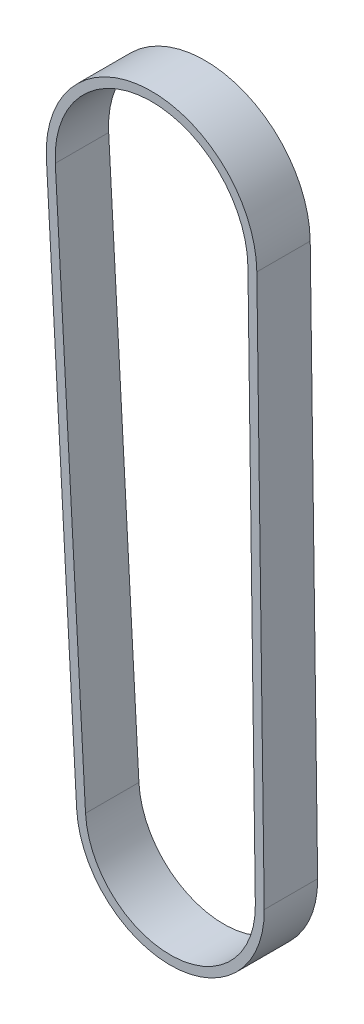
ISO-10303-21;
HEADER;
FILE_DESCRIPTION(('STEP AP214'),'2;1');
FILE_NAME('part.step','',(''),(''),'','','');
FILE_SCHEMA(('AUTOMOTIVE_DESIGN { 1 0 10303 214 1 1 1 1 }'));
ENDSEC;
DATA;
#1=APPLICATION_CONTEXT('core data for automotive mechanical design processes');
#2=APPLICATION_PROTOCOL_DEFINITION('international standard','automotive_design',2000,#1);
#3=PRODUCT_CONTEXT('',#1,'mechanical');
#4=PRODUCT('Part','Part','',(#3));
#5=PRODUCT_RELATED_PRODUCT_CATEGORY('part','',(#4));
#6=PRODUCT_DEFINITION_FORMATION('','',#4);
#7=PRODUCT_DEFINITION_CONTEXT('part definition',#1,'design');
#8=PRODUCT_DEFINITION('design','',#6,#7);
#9=PRODUCT_DEFINITION_SHAPE('','',#8);
#10=(LENGTH_UNIT() NAMED_UNIT(*) SI_UNIT(.MILLI.,.METRE.));
#11=(NAMED_UNIT(*) PLANE_ANGLE_UNIT() SI_UNIT($,.RADIAN.));
#12=(NAMED_UNIT(*) SI_UNIT($,.STERADIAN.) SOLID_ANGLE_UNIT());
#13=UNCERTAINTY_MEASURE_WITH_UNIT(LENGTH_MEASURE(1.E-05),#10,'distance_accuracy_value','');
#14=(GEOMETRIC_REPRESENTATION_CONTEXT(3) GLOBAL_UNCERTAINTY_ASSIGNED_CONTEXT((#13)) GLOBAL_UNIT_ASSIGNED_CONTEXT((#10,
#11,#12)) REPRESENTATION_CONTEXT('',''));
#15=CARTESIAN_POINT('',(0.,0.,0.));
#16=DIRECTION('',(0.,0.,1.));
#17=DIRECTION('',(1.,0.,0.));
#18=AXIS2_PLACEMENT_3D('',#15,#16,#17);
#19=CARTESIAN_POINT('',(3.17500000000004,-92.445492336214,-9.));
#20=DIRECTION('',(0.,0.,1.));
#21=DIRECTION('',(1.,0.,0.));
#22=AXIS2_PLACEMENT_3D('',#19,#20,#21);
#23=CYLINDRICAL_SURFACE('',#22,15.82394488);
#24=CARTESIAN_POINT('',(3.17500000000004,-92.445492336214,0.));
#25=DIRECTION('',(0.,0.,-1.));
#26=DIRECTION('',(-1.,0.,0.));
#27=AXIS2_PLACEMENT_3D('',#24,#25,#26);
#28=CIRCLE('',#27,15.82394488);
#29=CARTESIAN_POINT('',(-12.624882357185,-93.3178162808526,0.));
#30=VERTEX_POINT('',#29);
#31=CARTESIAN_POINT('',(18.9975013753443,-92.2317593427205,0.));
#32=VERTEX_POINT('',#31);
#33=EDGE_CURVE('E165',#30,#32,#28,.F.);
#34=ORIENTED_EDGE('',*,*,#33,.F.);
#35=DIRECTION('',(0.,0.,1.));
#36=VECTOR('',#35,1.);
#37=CARTESIAN_POINT('',(-12.624882357185,-93.3178162808526,-9.));
#38=LINE('',#37,#36);
#39=CARTESIAN_POINT('',(-12.624882357185,-93.3178162808526,-9.));
#40=VERTEX_POINT('',#39);
#41=EDGE_CURVE('E12',#40,#30,#38,.T.);
#42=ORIENTED_EDGE('',*,*,#41,.F.);
#43=CARTESIAN_POINT('',(3.17500000000004,-92.445492336214,-9.));
#44=DIRECTION('',(0.,0.,-1.));
#45=DIRECTION('',(-1.,0.,0.));
#46=AXIS2_PLACEMENT_3D('',#43,#44,#45);
#47=CIRCLE('',#46,15.82394488);
#48=CARTESIAN_POINT('',(18.9975013753443,-92.2317593427205,-9.));
#49=VERTEX_POINT('',#48);
#50=EDGE_CURVE('E169',#40,#49,#47,.F.);
#51=ORIENTED_EDGE('',*,*,#50,.T.);
#52=DIRECTION('',(0.,0.,1.));
#53=VECTOR('',#52,1.);
#54=CARTESIAN_POINT('',(18.9975013753443,-92.2317593427205,-9.));
#55=LINE('',#54,#53);
#56=EDGE_CURVE('E70',#49,#32,#55,.T.);
#57=ORIENTED_EDGE('',*,*,#56,.T.);
#58=EDGE_LOOP('',(#34,#42,#51,#57));
#59=FACE_BOUND('',#58,.T.);
#60=ADVANCED_FACE('F67',(#59),#23,.T.);
#61=CARTESIAN_POINT('',(-12.624882357185,-93.3178162808526,-9.));
#62=DIRECTION('',(-0.998479360045968,-0.0551268315994421,0.));
#63=DIRECTION('',(0.0551268315994421,-0.998479360045968,0.));
#64=AXIS2_PLACEMENT_3D('',#61,#62,#63);
#65=PLANE('',#64);
#66=DIRECTION('',(0.0551268315994422,-0.998479360045969,0.));
#67=VECTOR('',#66,1.);
#68=CARTESIAN_POINT('',(-12.624882357185,-93.3178162808526,0.));
#69=LINE('',#68,#67);
#70=CARTESIAN_POINT('',(-17.7230086408159,-0.978501260890095,0.));
#71=VERTEX_POINT('',#70);
#72=EDGE_CURVE('E173',#71,#30,#69,.T.);
#73=ORIENTED_EDGE('',*,*,#72,.F.);
#74=DIRECTION('',(0.,0.,1.));
#75=VECTOR('',#74,1.);
#76=CARTESIAN_POINT('',(-17.7230086408159,-0.978501260890095,-9.));
#77=LINE('',#76,#75);
#78=CARTESIAN_POINT('',(-17.7230086408159,-0.978501260890095,-9.));
#79=VERTEX_POINT('',#78);
#80=EDGE_CURVE('E75',#79,#71,#77,.T.);
#81=ORIENTED_EDGE('',*,*,#80,.F.);
#82=DIRECTION('',(0.0551268315994422,-0.998479360045969,0.));
#83=VECTOR('',#82,1.);
#84=CARTESIAN_POINT('',(-12.624882357185,-93.3178162808526,-9.));
#85=LINE('',#84,#83);
#86=EDGE_CURVE('E179',#79,#40,#85,.T.);
#87=ORIENTED_EDGE('',*,*,#86,.T.);
#88=ORIENTED_EDGE('',*,*,#41,.T.);
#89=EDGE_LOOP('',(#73,#81,#87,#88));
#90=FACE_BOUND('',#89,.T.);
#91=ADVANCED_FACE('F205',(#90),#65,.T.);
#92=CARTESIAN_POINT('',(0.,0.,-9.));
#93=DIRECTION('',(0.,0.,1.));
#94=DIRECTION('',(1.,0.,0.));
#95=AXIS2_PLACEMENT_3D('',#92,#93,#94);
#96=CYLINDRICAL_SURFACE('',#95,17.75);
#97=CARTESIAN_POINT('',(0.,0.,0.));
#98=DIRECTION('',(0.,0.,-1.));
#99=DIRECTION('',(-1.,0.,0.));
#100=AXIS2_PLACEMENT_3D('',#97,#98,#99);
#101=CIRCLE('',#100,17.75);
#102=CARTESIAN_POINT('',(17.7483807951915,0.239748094629936,0.));
#103=VERTEX_POINT('',#102);
#104=EDGE_CURVE('E187',#103,#71,#101,.F.);
#105=ORIENTED_EDGE('',*,*,#104,.F.);
#106=DIRECTION('',(0.,0.,1.));
#107=VECTOR('',#106,1.);
#108=CARTESIAN_POINT('',(17.7483807951915,0.239748094629936,-9.));
#109=LINE('',#108,#107);
#110=CARTESIAN_POINT('',(17.7483807951915,0.239748094629936,-9.));
#111=VERTEX_POINT('',#110);
#112=EDGE_CURVE('E192',#111,#103,#109,.T.);
#113=ORIENTED_EDGE('',*,*,#112,.F.);
#114=CARTESIAN_POINT('',(0.,0.,-9.));
#115=DIRECTION('',(0.,0.,-1.));
#116=DIRECTION('',(-1.,0.,0.));
#117=AXIS2_PLACEMENT_3D('',#114,#115,#116);
#118=CIRCLE('',#117,17.75);
#119=EDGE_CURVE('E176',#111,#79,#118,.F.);
#120=ORIENTED_EDGE('',*,*,#119,.T.);
#121=ORIENTED_EDGE('',*,*,#80,.T.);
#122=EDGE_LOOP('',(#105,#113,#120,#121));
#123=FACE_BOUND('',#122,.T.);
#124=ADVANCED_FACE('F209',(#123),#96,.T.);
#125=CARTESIAN_POINT('',(18.9975013753443,-92.2317593427205,-9.));
#126=DIRECTION('',(0.999908777193885,0.0135069349087288,0.));
#127=DIRECTION('',(-0.0135069349087288,0.999908777193885,0.));
#128=AXIS2_PLACEMENT_3D('',#125,#126,#127);
#129=PLANE('',#128);
#130=DIRECTION('',(-0.0135069349087288,0.999908777193886,0.));
#131=VECTOR('',#130,1.);
#132=CARTESIAN_POINT('',(18.9975013753443,-92.2317593427205,0.));
#133=LINE('',#132,#131);
#134=EDGE_CURVE('E184',#32,#103,#133,.T.);
#135=ORIENTED_EDGE('',*,*,#134,.F.);
#136=ORIENTED_EDGE('',*,*,#56,.F.);
#137=DIRECTION('',(-0.0135069349087288,0.999908777193886,0.));
#138=VECTOR('',#137,1.);
#139=CARTESIAN_POINT('',(18.9975013753443,-92.2317593427205,-9.));
#140=LINE('',#139,#138);
#141=EDGE_CURVE('E172',#49,#111,#140,.T.);
#142=ORIENTED_EDGE('',*,*,#141,.T.);
#143=ORIENTED_EDGE('',*,*,#112,.T.);
#144=EDGE_LOOP('',(#135,#136,#142,#143));
#145=FACE_BOUND('',#144,.T.);
#146=ADVANCED_FACE('F200',(#145),#129,.T.);
#147=CARTESIAN_POINT('',(3.17500000000004,-92.445492336214,-9.));
#148=DIRECTION('',(0.,0.,-1.));
#149=DIRECTION('',(-1.,0.,0.));
#150=AXIS2_PLACEMENT_3D('',#147,#148,#149);
#151=PLANE('',#150);
#152=CARTESIAN_POINT('',(3.17500000000004,-92.445492336214,-9.));
#153=DIRECTION('',(0.,0.,1.));
#154=DIRECTION('',(-1.,0.,0.));
#155=AXIS2_PLACEMENT_3D('',#152,#153,#154);
#156=CIRCLE('',#155,14.32394488);
#157=CARTESIAN_POINT('',(-11.1271633171161,-93.2351260334534,-9.));
#158=VERTEX_POINT('',#157);
#159=CARTESIAN_POINT('',(17.4976382095535,-92.2520197450836,-9.));
#160=VERTEX_POINT('',#159);
#161=EDGE_CURVE('E134',#158,#160,#156,.T.);
#162=ORIENTED_EDGE('',*,*,#161,.T.);
#163=DIRECTION('',(-0.0135069349087288,0.999908777193885,0.));
#164=VECTOR('',#163,1.);
#165=CARTESIAN_POINT('',(16.2485176294006,0.219487692266843,-9.));
#166=LINE('',#165,#164);
#167=CARTESIAN_POINT('',(16.2485176294006,0.219487692266845,-9.));
#168=VERTEX_POINT('',#167);
#169=EDGE_CURVE('E143',#160,#168,#166,.T.);
#170=ORIENTED_EDGE('',*,*,#169,.T.);
#171=CARTESIAN_POINT('',(0.,0.,-9.));
#172=DIRECTION('',(0.,0.,1.));
#173=DIRECTION('',(-1.,0.,0.));
#174=AXIS2_PLACEMENT_3D('',#171,#172,#173);
#175=CIRCLE('',#174,16.25);
#176=CARTESIAN_POINT('',(-16.225289600747,-0.895811013490932,-9.));
#177=VERTEX_POINT('',#176);
#178=EDGE_CURVE('E83',#168,#177,#175,.T.);
#179=ORIENTED_EDGE('',*,*,#178,.T.);
#180=DIRECTION('',(0.0551268315994421,-0.998479360045968,0.));
#181=VECTOR('',#180,1.);
#182=CARTESIAN_POINT('',(-11.1271633171161,-93.2351260334534,-9.));
#183=LINE('',#182,#181);
#184=EDGE_CURVE('E140',#177,#158,#183,.T.);
#185=ORIENTED_EDGE('',*,*,#184,.T.);
#186=EDGE_LOOP('',(#162,#170,#179,#185));
#187=FACE_BOUND('',#186,.T.);
#188=ORIENTED_EDGE('',*,*,#50,.F.);
#189=ORIENTED_EDGE('',*,*,#86,.F.);
#190=ORIENTED_EDGE('',*,*,#119,.F.);
#191=ORIENTED_EDGE('',*,*,#141,.F.);
#192=EDGE_LOOP('',(#188,#189,#190,#191));
#193=FACE_BOUND('',#192,.T.);
#194=ADVANCED_FACE('F147',(#187,#193),#151,.T.);
#195=CARTESIAN_POINT('',(3.17500000000004,-92.445492336214,0.));
#196=DIRECTION('',(0.,0.,-1.));
#197=DIRECTION('',(-1.,0.,0.));
#198=AXIS2_PLACEMENT_3D('',#195,#196,#197);
#199=PLANE('',#198);
#200=DIRECTION('',(-0.0135069349087288,0.999908777193885,0.));
#201=VECTOR('',#200,1.);
#202=CARTESIAN_POINT('',(16.2485176294006,0.219487692266843,0.));
#203=LINE('',#202,#201);
#204=CARTESIAN_POINT('',(17.4976382095535,-92.2520197450836,0.));
#205=VERTEX_POINT('',#204);
#206=CARTESIAN_POINT('',(16.2485176294006,0.219487692266843,0.));
#207=VERTEX_POINT('',#206);
#208=EDGE_CURVE('E159',#205,#207,#203,.T.);
#209=ORIENTED_EDGE('',*,*,#208,.F.);
#210=CARTESIAN_POINT('',(3.17500000000004,-92.445492336214,0.));
#211=DIRECTION('',(0.,0.,1.));
#212=DIRECTION('',(-1.,0.,0.));
#213=AXIS2_PLACEMENT_3D('',#210,#211,#212);
#214=CIRCLE('',#213,14.32394488);
#215=CARTESIAN_POINT('',(-11.1271633171161,-93.2351260334534,0.));
#216=VERTEX_POINT('',#215);
#217=EDGE_CURVE('E91',#216,#205,#214,.T.);
#218=ORIENTED_EDGE('',*,*,#217,.F.);
#219=DIRECTION('',(0.0551268315994421,-0.998479360045968,0.));
#220=VECTOR('',#219,1.);
#221=CARTESIAN_POINT('',(-11.1271633171161,-93.2351260334534,0.));
#222=LINE('',#221,#220);
#223=CARTESIAN_POINT('',(-16.225289600747,-0.895811013490932,0.));
#224=VERTEX_POINT('',#223);
#225=EDGE_CURVE('E150',#224,#216,#222,.T.);
#226=ORIENTED_EDGE('',*,*,#225,.F.);
#227=CARTESIAN_POINT('',(0.,0.,0.));
#228=DIRECTION('',(0.,0.,1.));
#229=DIRECTION('',(-1.,0.,0.));
#230=AXIS2_PLACEMENT_3D('',#227,#228,#229);
#231=CIRCLE('',#230,16.25);
#232=EDGE_CURVE('E153',#207,#224,#231,.T.);
#233=ORIENTED_EDGE('',*,*,#232,.F.);
#234=EDGE_LOOP('',(#209,#218,#226,#233));
#235=FACE_BOUND('',#234,.T.);
#236=ORIENTED_EDGE('',*,*,#33,.T.);
#237=ORIENTED_EDGE('',*,*,#134,.T.);
#238=ORIENTED_EDGE('',*,*,#104,.T.);
#239=ORIENTED_EDGE('',*,*,#72,.T.);
#240=EDGE_LOOP('',(#236,#237,#238,#239));
#241=FACE_BOUND('',#240,.T.);
#242=ADVANCED_FACE('F202',(#235,#241),#199,.F.);
#243=CARTESIAN_POINT('',(3.17500000000004,-92.445492336214,-9.));
#244=DIRECTION('',(0.,0.,1.));
#245=DIRECTION('',(1.,0.,0.));
#246=AXIS2_PLACEMENT_3D('',#243,#244,#245);
#247=CYLINDRICAL_SURFACE('',#246,14.32394488);
#248=ORIENTED_EDGE('',*,*,#217,.T.);
#249=DIRECTION('',(0.,0.,1.));
#250=VECTOR('',#249,1.);
#251=CARTESIAN_POINT('',(17.4976382095535,-92.2520197450836,-9.));
#252=LINE('',#251,#250);
#253=EDGE_CURVE('E130',#160,#205,#252,.T.);
#254=ORIENTED_EDGE('',*,*,#253,.F.);
#255=ORIENTED_EDGE('',*,*,#161,.F.);
#256=DIRECTION('',(0.,0.,1.));
#257=VECTOR('',#256,1.);
#258=CARTESIAN_POINT('',(-11.1271633171161,-93.2351260334534,-9.));
#259=LINE('',#258,#257);
#260=EDGE_CURVE('E163',#158,#216,#259,.T.);
#261=ORIENTED_EDGE('',*,*,#260,.T.);
#262=EDGE_LOOP('',(#248,#254,#255,#261));
#263=FACE_BOUND('',#262,.T.);
#264=ADVANCED_FACE('F132',(#263),#247,.F.);
#265=CARTESIAN_POINT('',(-11.1271633171161,-93.2351260334534,-9.));
#266=DIRECTION('',(-0.998479360045968,-0.0551268315994421,0.));
#267=DIRECTION('',(0.0551268315994422,-0.998479360045969,0.));
#268=AXIS2_PLACEMENT_3D('',#265,#266,#267);
#269=PLANE('',#268);
#270=ORIENTED_EDGE('',*,*,#225,.T.);
#271=ORIENTED_EDGE('',*,*,#260,.F.);
#272=ORIENTED_EDGE('',*,*,#184,.F.);
#273=DIRECTION('',(0.,0.,1.));
#274=VECTOR('',#273,1.);
#275=CARTESIAN_POINT('',(-16.225289600747,-0.895811013490932,-9.));
#276=LINE('',#275,#274);
#277=EDGE_CURVE('E166',#177,#224,#276,.T.);
#278=ORIENTED_EDGE('',*,*,#277,.T.);
#279=EDGE_LOOP('',(#270,#271,#272,#278));
#280=FACE_BOUND('',#279,.T.);
#281=ADVANCED_FACE('F262',(#280),#269,.F.);
#282=CARTESIAN_POINT('',(0.,0.,-9.));
#283=DIRECTION('',(0.,0.,1.));
#284=DIRECTION('',(1.,0.,0.));
#285=AXIS2_PLACEMENT_3D('',#282,#283,#284);
#286=CYLINDRICAL_SURFACE('',#285,16.25);
#287=ORIENTED_EDGE('',*,*,#232,.T.);
#288=ORIENTED_EDGE('',*,*,#277,.F.);
#289=ORIENTED_EDGE('',*,*,#178,.F.);
#290=DIRECTION('',(0.,0.,1.));
#291=VECTOR('',#290,1.);
#292=CARTESIAN_POINT('',(16.2485176294006,0.219487692266843,-9.));
#293=LINE('',#292,#291);
#294=EDGE_CURVE('E139',#168,#207,#293,.T.);
#295=ORIENTED_EDGE('',*,*,#294,.T.);
#296=EDGE_LOOP('',(#287,#288,#289,#295));
#297=FACE_BOUND('',#296,.T.);
#298=ADVANCED_FACE('F271',(#297),#286,.F.);
#299=CARTESIAN_POINT('',(16.2485176294006,0.219487692266843,-9.));
#300=DIRECTION('',(0.999908777193885,0.0135069349087288,0.));
#301=DIRECTION('',(-0.0135069349087288,0.999908777193885,0.));
#302=AXIS2_PLACEMENT_3D('',#299,#300,#301);
#303=PLANE('',#302);
#304=ORIENTED_EDGE('',*,*,#208,.T.);
#305=ORIENTED_EDGE('',*,*,#294,.F.);
#306=ORIENTED_EDGE('',*,*,#169,.F.);
#307=ORIENTED_EDGE('',*,*,#253,.T.);
#308=EDGE_LOOP('',(#304,#305,#306,#307));
#309=FACE_BOUND('',#308,.T.);
#310=ADVANCED_FACE('F144',(#309),#303,.F.);
#311=CLOSED_SHELL('',(#60,#91,#124,#146,#194,#242,#264,#281,#298,#310));
#312=MANIFOLD_SOLID_BREP('B2',#311);
#313=ADVANCED_BREP_SHAPE_REPRESENTATION('',(#18,#312),#14);
#314=SHAPE_DEFINITION_REPRESENTATION(#9,#313);
ENDSEC;
END-ISO-10303-21;
